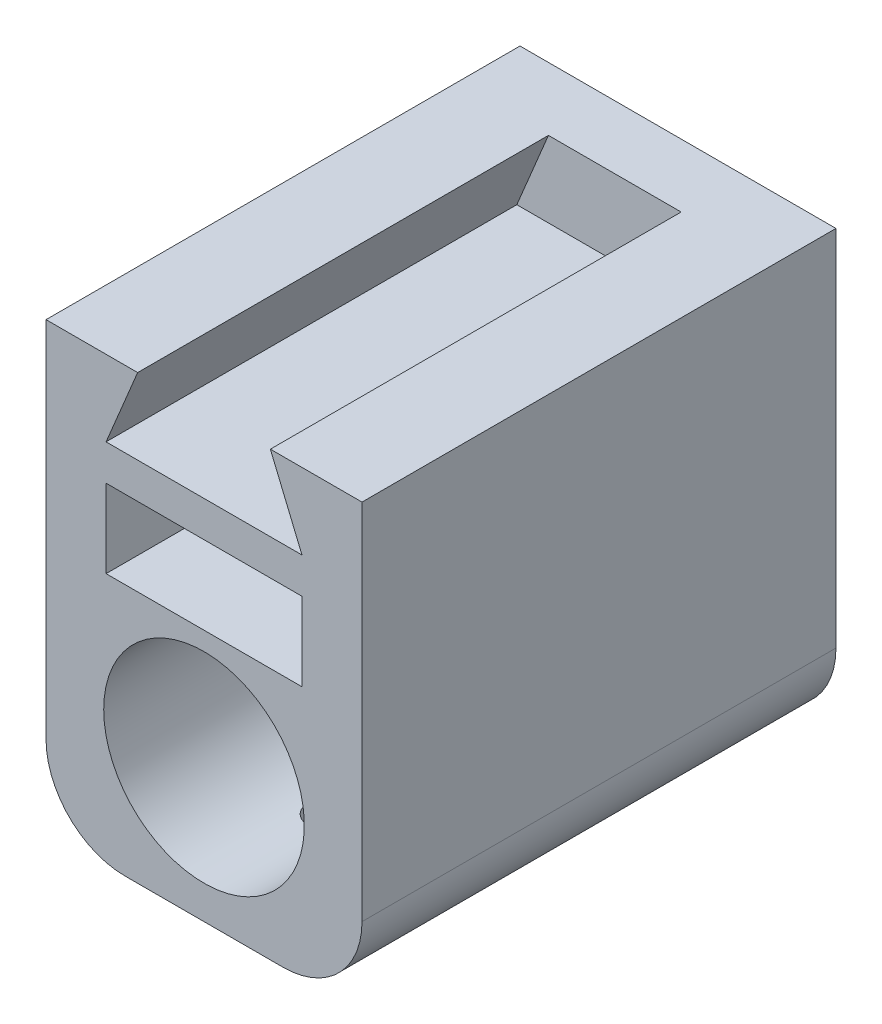
ISO-10303-21;
HEADER;
FILE_DESCRIPTION(('STEP AP214'),'2;1');
FILE_NAME('part.step','',(''),(''),'','','');
FILE_SCHEMA(('AUTOMOTIVE_DESIGN { 1 0 10303 214 1 1 1 1 }'));
ENDSEC;
DATA;
#1=APPLICATION_CONTEXT('core data for automotive mechanical design processes');
#2=APPLICATION_PROTOCOL_DEFINITION('international standard','automotive_design',2000,#1);
#3=PRODUCT_CONTEXT('',#1,'mechanical');
#4=PRODUCT('Part','Part','',(#3));
#5=PRODUCT_RELATED_PRODUCT_CATEGORY('part','',(#4));
#6=PRODUCT_DEFINITION_FORMATION('','',#4);
#7=PRODUCT_DEFINITION_CONTEXT('part definition',#1,'design');
#8=PRODUCT_DEFINITION('design','',#6,#7);
#9=PRODUCT_DEFINITION_SHAPE('','',#8);
#10=(LENGTH_UNIT() NAMED_UNIT(*) SI_UNIT(.MILLI.,.METRE.));
#11=(NAMED_UNIT(*) PLANE_ANGLE_UNIT() SI_UNIT($,.RADIAN.));
#12=(NAMED_UNIT(*) SI_UNIT($,.STERADIAN.) SOLID_ANGLE_UNIT());
#13=UNCERTAINTY_MEASURE_WITH_UNIT(LENGTH_MEASURE(1.E-05),#10,'distance_accuracy_value','');
#14=(GEOMETRIC_REPRESENTATION_CONTEXT(3) GLOBAL_UNCERTAINTY_ASSIGNED_CONTEXT((#13)) GLOBAL_UNIT_ASSIGNED_CONTEXT((#10,
#11,#12)) REPRESENTATION_CONTEXT('',''));
#15=CARTESIAN_POINT('',(0.,0.,0.));
#16=DIRECTION('',(0.,0.,1.));
#17=DIRECTION('',(1.,0.,0.));
#18=AXIS2_PLACEMENT_3D('',#15,#16,#17);
#19=CARTESIAN_POINT('',(-4.2,8.41779703520745,30.));
#20=DIRECTION('',(-0.923076923076923,0.384615384615385,0.));
#21=DIRECTION('',(-0.384615384615385,-0.923076923076923,0.));
#22=AXIS2_PLACEMENT_3D('',#19,#20,#21);
#23=PLANE('',#22);
#24=DIRECTION('',(-0.384615384615385,-0.923076923076923,0.));
#25=VECTOR('',#24,1.);
#26=CARTESIAN_POINT('',(-6.2,3.61779703520745,4.));
#27=LINE('',#26,#25);
#28=CARTESIAN_POINT('',(-4.2,8.41779703520745,4.));
#29=VERTEX_POINT('',#28);
#30=CARTESIAN_POINT('',(-6.2,3.61779703520745,4.));
#31=VERTEX_POINT('',#30);
#32=EDGE_CURVE('E513',#29,#31,#27,.T.);
#33=ORIENTED_EDGE('',*,*,#32,.F.);
#34=DIRECTION('',(0.,0.,-1.));
#35=VECTOR('',#34,1.);
#36=CARTESIAN_POINT('',(-4.2,8.41779703520745,30.));
#37=LINE('',#36,#35);
#38=CARTESIAN_POINT('',(-4.2,8.41779703520745,30.));
#39=VERTEX_POINT('',#38);
#40=EDGE_CURVE('E276',#39,#29,#37,.T.);
#41=ORIENTED_EDGE('',*,*,#40,.F.);
#42=DIRECTION('',(0.384615384615385,0.923076923076923,0.));
#43=VECTOR('',#42,1.);
#44=CARTESIAN_POINT('',(-4.2,8.41779703520745,30.));
#45=LINE('',#44,#43);
#46=CARTESIAN_POINT('',(-6.2,3.61779703520745,30.));
#47=VERTEX_POINT('',#46);
#48=EDGE_CURVE('E221',#47,#39,#45,.T.);
#49=ORIENTED_EDGE('',*,*,#48,.F.);
#50=DIRECTION('',(0.,0.,-1.));
#51=VECTOR('',#50,1.);
#52=CARTESIAN_POINT('',(-6.2,3.61779703520745,30.));
#53=LINE('',#52,#51);
#54=EDGE_CURVE('E247',#47,#31,#53,.T.);
#55=ORIENTED_EDGE('',*,*,#54,.T.);
#56=EDGE_LOOP('',(#33,#41,#49,#55));
#57=FACE_BOUND('',#56,.T.);
#58=ADVANCED_FACE('F45',(#57),#23,.F.);
#59=CARTESIAN_POINT('',(6.2,3.61779703520745,30.));
#60=DIRECTION('',(0.923076923076923,0.384615384615385,0.));
#61=DIRECTION('',(-0.384615384615385,0.923076923076923,0.));
#62=AXIS2_PLACEMENT_3D('',#59,#60,#61);
#63=PLANE('',#62);
#64=DIRECTION('',(-0.384615384615385,0.923076923076923,0.));
#65=VECTOR('',#64,1.);
#66=CARTESIAN_POINT('',(4.2,8.41779703520745,4.));
#67=LINE('',#66,#65);
#68=CARTESIAN_POINT('',(6.2,3.61779703520745,4.));
#69=VERTEX_POINT('',#68);
#70=CARTESIAN_POINT('',(4.2,8.41779703520745,4.));
#71=VERTEX_POINT('',#70);
#72=EDGE_CURVE('E196',#69,#71,#67,.T.);
#73=ORIENTED_EDGE('',*,*,#72,.F.);
#74=DIRECTION('',(0.,0.,-1.));
#75=VECTOR('',#74,1.);
#76=CARTESIAN_POINT('',(6.2,3.61779703520745,30.));
#77=LINE('',#76,#75);
#78=CARTESIAN_POINT('',(6.2,3.61779703520745,30.));
#79=VERTEX_POINT('',#78);
#80=EDGE_CURVE('E261',#79,#69,#77,.T.);
#81=ORIENTED_EDGE('',*,*,#80,.F.);
#82=DIRECTION('',(0.384615384615385,-0.923076923076923,0.));
#83=VECTOR('',#82,1.);
#84=CARTESIAN_POINT('',(6.2,3.61779703520745,30.));
#85=LINE('',#84,#83);
#86=CARTESIAN_POINT('',(4.2,8.41779703520745,30.));
#87=VERTEX_POINT('',#86);
#88=EDGE_CURVE('E241',#87,#79,#85,.T.);
#89=ORIENTED_EDGE('',*,*,#88,.F.);
#90=DIRECTION('',(0.,0.,-1.));
#91=VECTOR('',#90,1.);
#92=CARTESIAN_POINT('',(4.2,8.41779703520745,30.));
#93=LINE('',#92,#91);
#94=EDGE_CURVE('E265',#87,#71,#93,.T.);
#95=ORIENTED_EDGE('',*,*,#94,.T.);
#96=EDGE_LOOP('',(#73,#81,#89,#95));
#97=FACE_BOUND('',#96,.T.);
#98=ADVANCED_FACE('F340',(#97),#63,.F.);
#99=CARTESIAN_POINT('',(-6.2,3.61779703520745,30.));
#100=DIRECTION('',(0.,-1.,0.));
#101=DIRECTION('',(0.,0.,-1.));
#102=AXIS2_PLACEMENT_3D('',#99,#100,#101);
#103=PLANE('',#102);
#104=DIRECTION('',(1.,0.,0.));
#105=VECTOR('',#104,1.);
#106=CARTESIAN_POINT('',(6.2,3.61779703520745,4.));
#107=LINE('',#106,#105);
#108=EDGE_CURVE('E381',#31,#69,#107,.T.);
#109=ORIENTED_EDGE('',*,*,#108,.F.);
#110=ORIENTED_EDGE('',*,*,#54,.F.);
#111=DIRECTION('',(-1.,0.,0.));
#112=VECTOR('',#111,1.);
#113=CARTESIAN_POINT('',(-6.2,3.61779703520745,30.));
#114=LINE('',#113,#112);
#115=EDGE_CURVE('E244',#79,#47,#114,.T.);
#116=ORIENTED_EDGE('',*,*,#115,.F.);
#117=ORIENTED_EDGE('',*,*,#80,.T.);
#118=EDGE_LOOP('',(#109,#110,#116,#117));
#119=FACE_BOUND('',#118,.T.);
#120=ADVANCED_FACE('F346',(#119),#103,.F.);
#121=CARTESIAN_POINT('',(0.,0.,30.));
#122=DIRECTION('',(0.,0.,1.));
#123=DIRECTION('',(1.,0.,0.));
#124=AXIS2_PLACEMENT_3D('',#121,#122,#123);
#125=PLANE('',#124);
#126=DIRECTION('',(1.,0.,0.));
#127=VECTOR('',#126,1.);
#128=CARTESIAN_POINT('',(-10.,-19.5822029647926,30.));
#129=LINE('',#128,#127);
#130=CARTESIAN_POINT('',(-5.,-19.5822029647926,30.));
#131=VERTEX_POINT('',#130);
#132=CARTESIAN_POINT('',(5.,-19.5822029647926,30.));
#133=VERTEX_POINT('',#132);
#134=EDGE_CURVE('E232',#131,#133,#129,.T.);
#135=ORIENTED_EDGE('',*,*,#134,.T.);
#136=CARTESIAN_POINT('',(5.,-14.5822029647926,30.));
#137=DIRECTION('',(0.,0.,1.));
#138=DIRECTION('',(1.,0.,0.));
#139=AXIS2_PLACEMENT_3D('',#136,#137,#138);
#140=CIRCLE('',#139,5.);
#141=CARTESIAN_POINT('',(10.,-14.5822029647926,30.));
#142=VERTEX_POINT('',#141);
#143=EDGE_CURVE('E60',#133,#142,#140,.T.);
#144=ORIENTED_EDGE('',*,*,#143,.T.);
#145=DIRECTION('',(0.,1.,0.));
#146=VECTOR('',#145,1.);
#147=CARTESIAN_POINT('',(10.,-19.5822029647926,30.));
#148=LINE('',#147,#146);
#149=CARTESIAN_POINT('',(10.,8.41779703520745,30.));
#150=VERTEX_POINT('',#149);
#151=EDGE_CURVE('E235',#142,#150,#148,.T.);
#152=ORIENTED_EDGE('',*,*,#151,.T.);
#153=DIRECTION('',(-1.,0.,0.));
#154=VECTOR('',#153,1.);
#155=CARTESIAN_POINT('',(4.2,8.41779703520745,30.));
#156=LINE('',#155,#154);
#157=EDGE_CURVE('E238',#150,#87,#156,.T.);
#158=ORIENTED_EDGE('',*,*,#157,.T.);
#159=ORIENTED_EDGE('',*,*,#88,.T.);
#160=ORIENTED_EDGE('',*,*,#115,.T.);
#161=ORIENTED_EDGE('',*,*,#48,.T.);
#162=DIRECTION('',(-1.,0.,0.));
#163=VECTOR('',#162,1.);
#164=CARTESIAN_POINT('',(-4.2,8.41779703520745,30.));
#165=LINE('',#164,#163);
#166=CARTESIAN_POINT('',(-10.,8.41779703520745,30.));
#167=VERTEX_POINT('',#166);
#168=EDGE_CURVE('E225',#39,#167,#165,.T.);
#169=ORIENTED_EDGE('',*,*,#168,.T.);
#170=DIRECTION('',(0.,-1.,0.));
#171=VECTOR('',#170,1.);
#172=CARTESIAN_POINT('',(-10.,8.41779703520745,30.));
#173=LINE('',#172,#171);
#174=CARTESIAN_POINT('',(-10.,-14.5822029647926,30.));
#175=VERTEX_POINT('',#174);
#176=EDGE_CURVE('E229',#167,#175,#173,.T.);
#177=ORIENTED_EDGE('',*,*,#176,.T.);
#178=CARTESIAN_POINT('',(-5.,-14.5822029647926,30.));
#179=DIRECTION('',(0.,0.,1.));
#180=DIRECTION('',(1.,0.,0.));
#181=AXIS2_PLACEMENT_3D('',#178,#179,#180);
#182=CIRCLE('',#181,5.);
#183=EDGE_CURVE('E296',#175,#131,#182,.T.);
#184=ORIENTED_EDGE('',*,*,#183,.T.);
#185=EDGE_LOOP('',(#135,#144,#152,#158,#159,#160,#161,#169,#177,#184));
#186=FACE_BOUND('',#185,.T.);
#187=CARTESIAN_POINT('',(0.,-11.126254614674,30.));
#188=DIRECTION('',(0.,0.,1.));
#189=DIRECTION('',(-1.,0.,0.));
#190=AXIS2_PLACEMENT_3D('',#187,#188,#189);
#191=CIRCLE('',#190,6.35);
#192=CARTESIAN_POINT('',(-6.35,-11.126254614674,30.));
#193=VERTEX_POINT('',#192);
#194=EDGE_CURVE('E213',#193,#193,#191,.T.);
#195=ORIENTED_EDGE('',*,*,#194,.F.);
#196=EDGE_LOOP('',(#195));
#197=FACE_BOUND('',#196,.T.);
#198=DIRECTION('',(0.,-1.,0.));
#199=VECTOR('',#198,1.);
#200=CARTESIAN_POINT('',(-6.2,-3.60572029870184,30.));
#201=LINE('',#200,#199);
#202=CARTESIAN_POINT('',(-6.2,1.35321106935378,30.));
#203=VERTEX_POINT('',#202);
#204=CARTESIAN_POINT('',(-6.2,-3.60572029870184,30.));
#205=VERTEX_POINT('',#204);
#206=EDGE_CURVE('E168',#203,#205,#201,.T.);
#207=ORIENTED_EDGE('',*,*,#206,.F.);
#208=DIRECTION('',(-1.,0.,0.));
#209=VECTOR('',#208,1.);
#210=CARTESIAN_POINT('',(-6.2,1.35321106935378,30.));
#211=LINE('',#210,#209);
#212=CARTESIAN_POINT('',(6.2,1.35321106935378,30.));
#213=VERTEX_POINT('',#212);
#214=EDGE_CURVE('E157',#213,#203,#211,.T.);
#215=ORIENTED_EDGE('',*,*,#214,.F.);
#216=DIRECTION('',(0.,1.,0.));
#217=VECTOR('',#216,1.);
#218=CARTESIAN_POINT('',(6.2,-3.60572029870184,30.));
#219=LINE('',#218,#217);
#220=CARTESIAN_POINT('',(6.2,-3.60572029870184,30.));
#221=VERTEX_POINT('',#220);
#222=EDGE_CURVE('E187',#221,#213,#219,.T.);
#223=ORIENTED_EDGE('',*,*,#222,.F.);
#224=DIRECTION('',(1.,0.,0.));
#225=VECTOR('',#224,1.);
#226=CARTESIAN_POINT('',(-6.2,-3.60572029870184,30.));
#227=LINE('',#226,#225);
#228=EDGE_CURVE('E183',#205,#221,#227,.T.);
#229=ORIENTED_EDGE('',*,*,#228,.F.);
#230=EDGE_LOOP('',(#207,#215,#223,#229));
#231=FACE_BOUND('',#230,.T.);
#232=ADVANCED_FACE('F181',(#186,#197,#231),#125,.T.);
#233=CARTESIAN_POINT('',(0.,0.,0.));
#234=DIRECTION('',(0.,0.,1.));
#235=DIRECTION('',(1.,0.,0.));
#236=AXIS2_PLACEMENT_3D('',#233,#234,#235);
#237=PLANE('',#236);
#238=DIRECTION('',(0.,1.,0.));
#239=VECTOR('',#238,1.);
#240=CARTESIAN_POINT('',(10.,8.41779703520745,0.));
#241=LINE('',#240,#239);
#242=CARTESIAN_POINT('',(10.,-14.5822029647926,0.));
#243=VERTEX_POINT('',#242);
#244=CARTESIAN_POINT('',(10.,8.41779703520745,0.));
#245=VERTEX_POINT('',#244);
#246=EDGE_CURVE('E253',#243,#245,#241,.T.);
#247=ORIENTED_EDGE('',*,*,#246,.F.);
#248=CARTESIAN_POINT('',(5.,-14.5822029647926,0.));
#249=DIRECTION('',(0.,0.,1.));
#250=DIRECTION('',(1.,0.,0.));
#251=AXIS2_PLACEMENT_3D('',#248,#249,#250);
#252=CIRCLE('',#251,5.);
#253=CARTESIAN_POINT('',(5.,-19.5822029647926,0.));
#254=VERTEX_POINT('',#253);
#255=EDGE_CURVE('E287',#243,#254,#252,.F.);
#256=ORIENTED_EDGE('',*,*,#255,.T.);
#257=DIRECTION('',(1.,0.,0.));
#258=VECTOR('',#257,1.);
#259=CARTESIAN_POINT('',(-10.,-19.5822029647926,0.));
#260=LINE('',#259,#258);
#261=CARTESIAN_POINT('',(-5.,-19.5822029647926,0.));
#262=VERTEX_POINT('',#261);
#263=EDGE_CURVE('E250',#262,#254,#260,.T.);
#264=ORIENTED_EDGE('',*,*,#263,.F.);
#265=CARTESIAN_POINT('',(-5.,-14.5822029647926,0.));
#266=DIRECTION('',(0.,0.,1.));
#267=DIRECTION('',(1.,0.,0.));
#268=AXIS2_PLACEMENT_3D('',#265,#266,#267);
#269=CIRCLE('',#268,5.);
#270=CARTESIAN_POINT('',(-10.,-14.5822029647926,0.));
#271=VERTEX_POINT('',#270);
#272=EDGE_CURVE('E284',#262,#271,#269,.F.);
#273=ORIENTED_EDGE('',*,*,#272,.T.);
#274=DIRECTION('',(0.,-1.,0.));
#275=VECTOR('',#274,1.);
#276=CARTESIAN_POINT('',(-10.,-11.126254614674,0.));
#277=LINE('',#276,#275);
#278=CARTESIAN_POINT('',(-10.,8.41779703520745,0.));
#279=VERTEX_POINT('',#278);
#280=EDGE_CURVE('E217',#279,#271,#277,.T.);
#281=ORIENTED_EDGE('',*,*,#280,.F.);
#282=DIRECTION('',(-1.,0.,0.));
#283=VECTOR('',#282,1.);
#284=CARTESIAN_POINT('',(4.2,8.41779703520745,0.));
#285=LINE('',#284,#283);
#286=EDGE_CURVE('E226',#245,#279,#285,.T.);
#287=ORIENTED_EDGE('',*,*,#286,.F.);
#288=EDGE_LOOP('',(#247,#256,#264,#273,#281,#287));
#289=FACE_BOUND('',#288,.T.);
#290=CARTESIAN_POINT('',(0.,-11.126254614674,0.));
#291=DIRECTION('',(0.,0.,1.));
#292=DIRECTION('',(1.,0.,0.));
#293=AXIS2_PLACEMENT_3D('',#290,#291,#292);
#294=CIRCLE('',#293,6.35);
#295=CARTESIAN_POINT('',(6.35,-11.126254614674,0.));
#296=VERTEX_POINT('',#295);
#297=EDGE_CURVE('E177',#296,#296,#294,.T.);
#298=ORIENTED_EDGE('',*,*,#297,.T.);
#299=EDGE_LOOP('',(#298));
#300=FACE_BOUND('',#299,.T.);
#301=DIRECTION('',(-1.,0.,0.));
#302=VECTOR('',#301,1.);
#303=CARTESIAN_POINT('',(-6.2,1.35321106935378,0.));
#304=LINE('',#303,#302);
#305=CARTESIAN_POINT('',(6.2,1.35321106935378,0.));
#306=VERTEX_POINT('',#305);
#307=CARTESIAN_POINT('',(-6.2,1.35321106935378,0.));
#308=VERTEX_POINT('',#307);
#309=EDGE_CURVE('E193',#306,#308,#304,.T.);
#310=ORIENTED_EDGE('',*,*,#309,.T.);
#311=DIRECTION('',(0.,-1.,0.));
#312=VECTOR('',#311,1.);
#313=CARTESIAN_POINT('',(-6.2,-3.60572029870184,0.));
#314=LINE('',#313,#312);
#315=CARTESIAN_POINT('',(-6.2,-3.60572029870184,0.));
#316=VERTEX_POINT('',#315);
#317=EDGE_CURVE('E175',#308,#316,#314,.T.);
#318=ORIENTED_EDGE('',*,*,#317,.T.);
#319=DIRECTION('',(1.,0.,0.));
#320=VECTOR('',#319,1.);
#321=CARTESIAN_POINT('',(-6.2,-3.60572029870184,0.));
#322=LINE('',#321,#320);
#323=CARTESIAN_POINT('',(6.2,-3.60572029870184,0.));
#324=VERTEX_POINT('',#323);
#325=EDGE_CURVE('E199',#316,#324,#322,.T.);
#326=ORIENTED_EDGE('',*,*,#325,.T.);
#327=DIRECTION('',(0.,1.,0.));
#328=VECTOR('',#327,1.);
#329=CARTESIAN_POINT('',(6.2,-3.60572029870184,0.));
#330=LINE('',#329,#328);
#331=EDGE_CURVE('E169',#324,#306,#330,.T.);
#332=ORIENTED_EDGE('',*,*,#331,.T.);
#333=EDGE_LOOP('',(#310,#318,#326,#332));
#334=FACE_BOUND('',#333,.T.);
#335=ADVANCED_FACE('F389',(#289,#300,#334),#237,.F.);
#336=CARTESIAN_POINT('',(-10.,-11.126254614674,30.));
#337=DIRECTION('',(1.,0.,0.));
#338=DIRECTION('',(0.,0.,-1.));
#339=AXIS2_PLACEMENT_3D('',#336,#337,#338);
#340=PLANE('',#339);
#341=ORIENTED_EDGE('',*,*,#280,.T.);
#342=DIRECTION('',(0.,0.,-1.));
#343=VECTOR('',#342,1.);
#344=CARTESIAN_POINT('',(-10.,-14.5822029647926,30.));
#345=LINE('',#344,#343);
#346=EDGE_CURVE('E11',#271,#175,#345,.F.);
#347=ORIENTED_EDGE('',*,*,#346,.T.);
#348=ORIENTED_EDGE('',*,*,#176,.F.);
#349=DIRECTION('',(0.,0.,-1.));
#350=VECTOR('',#349,1.);
#351=CARTESIAN_POINT('',(-10.,8.41779703520745,30.));
#352=LINE('',#351,#350);
#353=EDGE_CURVE('E272',#167,#279,#352,.T.);
#354=ORIENTED_EDGE('',*,*,#353,.T.);
#355=EDGE_LOOP('',(#341,#347,#348,#354));
#356=FACE_BOUND('',#355,.T.);
#357=ADVANCED_FACE('F350',(#356),#340,.F.);
#358=CARTESIAN_POINT('',(-10.,-19.5822029647926,30.));
#359=DIRECTION('',(0.,1.,0.));
#360=DIRECTION('',(0.,0.,1.));
#361=AXIS2_PLACEMENT_3D('',#358,#359,#360);
#362=PLANE('',#361);
#363=CARTESIAN_POINT('',(0.,-19.5822029647926,22.5));
#364=DIRECTION('',(0.,-1.,0.));
#365=DIRECTION('',(0.,0.,-1.));
#366=AXIS2_PLACEMENT_3D('',#363,#364,#365);
#367=CIRCLE('',#366,1.);
#368=CARTESIAN_POINT('',(0.,-19.5822029647926,21.5));
#369=VERTEX_POINT('',#368);
#370=EDGE_CURVE('E307',#369,#369,#367,.T.);
#371=ORIENTED_EDGE('',*,*,#370,.F.);
#372=EDGE_LOOP('',(#371));
#373=FACE_BOUND('',#372,.T.);
#374=CARTESIAN_POINT('',(0.,-19.5822029647926,7.5));
#375=DIRECTION('',(0.,-1.,0.));
#376=DIRECTION('',(0.,0.,-1.));
#377=AXIS2_PLACEMENT_3D('',#374,#375,#376);
#378=CIRCLE('',#377,1.);
#379=CARTESIAN_POINT('',(0.,-19.5822029647926,6.5));
#380=VERTEX_POINT('',#379);
#381=EDGE_CURVE('E503',#380,#380,#378,.T.);
#382=ORIENTED_EDGE('',*,*,#381,.F.);
#383=EDGE_LOOP('',(#382));
#384=FACE_BOUND('',#383,.T.);
#385=ORIENTED_EDGE('',*,*,#263,.T.);
#386=DIRECTION('',(0.,0.,-1.));
#387=VECTOR('',#386,1.);
#388=CARTESIAN_POINT('',(5.,-19.5822029647926,30.));
#389=LINE('',#388,#387);
#390=EDGE_CURVE('E74',#254,#133,#389,.F.);
#391=ORIENTED_EDGE('',*,*,#390,.T.);
#392=ORIENTED_EDGE('',*,*,#134,.F.);
#393=DIRECTION('',(0.,0.,-1.));
#394=VECTOR('',#393,1.);
#395=CARTESIAN_POINT('',(-5.,-19.5822029647926,30.));
#396=LINE('',#395,#394);
#397=EDGE_CURVE('E290',#131,#262,#396,.T.);
#398=ORIENTED_EDGE('',*,*,#397,.T.);
#399=EDGE_LOOP('',(#385,#391,#392,#398));
#400=FACE_BOUND('',#399,.T.);
#401=ADVANCED_FACE('F388',(#373,#384,#400),#362,.F.);
#402=CARTESIAN_POINT('',(10.,8.41779703520745,30.));
#403=DIRECTION('',(-1.,0.,0.));
#404=DIRECTION('',(0.,-1.,0.));
#405=AXIS2_PLACEMENT_3D('',#402,#403,#404);
#406=PLANE('',#405);
#407=ORIENTED_EDGE('',*,*,#151,.F.);
#408=DIRECTION('',(0.,0.,-1.));
#409=VECTOR('',#408,1.);
#410=CARTESIAN_POINT('',(10.,-14.5822029647926,30.));
#411=LINE('',#410,#409);
#412=EDGE_CURVE('E280',#142,#243,#411,.T.);
#413=ORIENTED_EDGE('',*,*,#412,.T.);
#414=ORIENTED_EDGE('',*,*,#246,.T.);
#415=DIRECTION('',(0.,0.,-1.));
#416=VECTOR('',#415,1.);
#417=CARTESIAN_POINT('',(10.,8.41779703520745,30.));
#418=LINE('',#417,#416);
#419=EDGE_CURVE('E268',#150,#245,#418,.T.);
#420=ORIENTED_EDGE('',*,*,#419,.F.);
#421=EDGE_LOOP('',(#407,#413,#414,#420));
#422=FACE_BOUND('',#421,.T.);
#423=ADVANCED_FACE('F366',(#422),#406,.F.);
#424=CARTESIAN_POINT('',(4.2,8.41779703520745,30.));
#425=DIRECTION('',(0.,-1.,0.));
#426=DIRECTION('',(1.,0.,0.));
#427=AXIS2_PLACEMENT_3D('',#424,#425,#426);
#428=PLANE('',#427);
#429=ORIENTED_EDGE('',*,*,#286,.T.);
#430=ORIENTED_EDGE('',*,*,#353,.F.);
#431=ORIENTED_EDGE('',*,*,#168,.F.);
#432=ORIENTED_EDGE('',*,*,#40,.T.);
#433=DIRECTION('',(-1.,0.,0.));
#434=VECTOR('',#433,1.);
#435=CARTESIAN_POINT('',(-4.2,8.41779703520745,4.));
#436=LINE('',#435,#434);
#437=EDGE_CURVE('E509',#71,#29,#436,.T.);
#438=ORIENTED_EDGE('',*,*,#437,.F.);
#439=ORIENTED_EDGE('',*,*,#94,.F.);
#440=ORIENTED_EDGE('',*,*,#157,.F.);
#441=ORIENTED_EDGE('',*,*,#419,.T.);
#442=EDGE_LOOP('',(#429,#430,#431,#432,#438,#439,#440,#441));
#443=FACE_BOUND('',#442,.T.);
#444=ADVANCED_FACE('F337',(#443),#428,.F.);
#445=CARTESIAN_POINT('',(0.,-11.126254614674,30.));
#446=DIRECTION('',(0.,0.,-1.));
#447=DIRECTION('',(-1.,0.,0.));
#448=AXIS2_PLACEMENT_3D('',#445,#446,#447);
#449=CYLINDRICAL_SURFACE('',#448,6.35);
#450=CARTESIAN_POINT('',(0.,-17.476254614674,21.5));
#451=CARTESIAN_POINT('',(-0.0558003320742148,-17.4762536908854,21.5000022744791));
#452=CARTESIAN_POINT('',(-0.111632204345971,-17.4755114125861,21.5046862876585));
#453=CARTESIAN_POINT('',(-0.221733040867682,-17.4726217726161,21.5232925101723));
#454=CARTESIAN_POINT('',(-0.27600046905216,-17.470473076017,21.5372234966231));
#455=CARTESIAN_POINT('',(-0.381363300101671,-17.4650118639213,21.5738951205754));
#456=CARTESIAN_POINT('',(-0.432461150563512,-17.4617002599428,21.5966288596701));
#457=CARTESIAN_POINT('',(-0.530109710028942,-17.4542783730695,21.6502432675856));
#458=CARTESIAN_POINT('',(-0.576661000669009,-17.4501681925373,21.6811228924366));
#459=CARTESIAN_POINT('',(-0.664301485283561,-17.441566181924,21.7504344762484));
#460=CARTESIAN_POINT('',(-0.705346033614595,-17.437071665728,21.7889225596683));
#461=CARTESIAN_POINT('',(-0.780422532199137,-17.4282283639037,21.8722377304086));
#462=CARTESIAN_POINT('',(-0.814454062369895,-17.4238795870183,21.9170651971898));
#463=CARTESIAN_POINT('',(-0.874714554330391,-17.4157941144934,22.0120895879895));
#464=CARTESIAN_POINT('',(-0.900899900075353,-17.4120608904201,22.0623144925598));
#465=CARTESIAN_POINT('',(-0.944445905783669,-17.4056661588008,22.1665183032244));
#466=CARTESIAN_POINT('',(-0.961807096589749,-17.4030045867885,22.2204969832773));
#467=CARTESIAN_POINT('',(-0.987072427331072,-17.3990810730485,22.3302048769125));
#468=CARTESIAN_POINT('',(-0.995053290270382,-17.3978077826757,22.385916008074));
#469=CARTESIAN_POINT('',(-1.00156918614343,-17.3967706019149,22.4979001431011));
#470=CARTESIAN_POINT('',(-1.00010481624194,-17.3970066161026,22.5541731112204));
#471=CARTESIAN_POINT('',(-0.987834423672059,-17.3989510069971,22.6651390759536));
#472=CARTESIAN_POINT('',(-0.977114171571099,-17.4006458647407,22.7198418280659));
#473=CARTESIAN_POINT('',(-0.946770735976996,-17.4052958381399,22.8266623919793));
#474=CARTESIAN_POINT('',(-0.927147277176521,-17.4082509927665,22.8787801237904));
#475=CARTESIAN_POINT('',(-0.879466242664416,-17.4151033782256,22.9792103474751));
#476=CARTESIAN_POINT('',(-0.851372648815282,-17.4190046180181,23.0275054543422));
#477=CARTESIAN_POINT('',(-0.787574434603871,-17.4273067560123,23.1187285784015));
#478=CARTESIAN_POINT('',(-0.751869264537582,-17.431707690291,23.1616562076019));
#479=CARTESIAN_POINT('',(-0.673392149324446,-17.4405729319837,23.2414226474905));
#480=CARTESIAN_POINT('',(-0.6305465273893,-17.4450374025829,23.2781889927632));
#481=CARTESIAN_POINT('',(-0.539255003541546,-17.4534816472325,23.344020728029));
#482=CARTESIAN_POINT('',(-0.490809072353763,-17.457461418749,23.3730860777631));
#483=CARTESIAN_POINT('',(-0.389626999025971,-17.4644926414162,23.4226957367411));
#484=CARTESIAN_POINT('',(-0.336887894532341,-17.4675434445646,23.4432341015959));
#485=CARTESIAN_POINT('',(-0.22865024848836,-17.4723676704995,23.4751419326766));
#486=CARTESIAN_POINT('',(-0.173151913090988,-17.474141188564,23.4865120828061));
#487=CARTESIAN_POINT('',(-0.0615962576314434,-17.476198314144,23.4996635502541));
#488=CARTESIAN_POINT('',(-0.00555095000512151,-17.4764973907391,23.5015444290229));
#489=CARTESIAN_POINT('',(0.106054399622533,-17.4756141574466,23.4959287389139));
#490=CARTESIAN_POINT('',(0.161614458165948,-17.4744318982577,23.4884324909674));
#491=CARTESIAN_POINT('',(0.270367992045286,-17.4707284026884,23.4643581399131));
#492=CARTESIAN_POINT('',(0.323572547262239,-17.4682143704866,23.447828885462));
#493=CARTESIAN_POINT('',(0.426455268587871,-17.4621282019962,23.4062094840152));
#494=CARTESIAN_POINT('',(0.47613325451107,-17.4585560116906,23.3811188999693));
#495=CARTESIAN_POINT('',(0.570988134930571,-17.4507117673559,23.3228579165361));
#496=CARTESIAN_POINT('',(0.616126046049681,-17.446434367899,23.2896247814204));
#497=CARTESIAN_POINT('',(0.700219628193461,-17.4376715169637,23.216108948676));
#498=CARTESIAN_POINT('',(0.739174900722006,-17.4331860520985,23.1758257969966));
#499=CARTESIAN_POINT('',(0.810162647236763,-17.4244631341654,23.0889087285473));
#500=CARTESIAN_POINT('',(0.842128146953117,-17.4202283419084,23.0422198035939));
#501=CARTESIAN_POINT('',(0.897762469378254,-17.4125344876773,22.9440766240687));
#502=CARTESIAN_POINT('',(0.921431533796842,-17.4090754031046,22.892622508382));
#503=CARTESIAN_POINT('',(0.959698884610136,-17.4033441895544,22.7866038142683));
#504=CARTESIAN_POINT('',(0.974331581661074,-17.401067563088,22.7320519103027));
#505=CARTESIAN_POINT('',(0.994219832561755,-17.397947368529,22.6212260675606));
#506=CARTESIAN_POINT('',(0.999476106451985,-17.3971036903967,22.5649522613511));
#507=CARTESIAN_POINT('',(1.00044388237755,-17.3969493054356,22.4529480902807));
#508=CARTESIAN_POINT('',(0.996260736883521,-17.3976216780419,22.3972186306957));
#509=CARTESIAN_POINT('',(0.978695073806124,-17.4003867263862,22.2872666377553));
#510=CARTESIAN_POINT('',(0.965312577226987,-17.4024793988812,22.2330441009596));
#511=CARTESIAN_POINT('',(0.929766717236151,-17.4078431143419,22.1276793785062));
#512=CARTESIAN_POINT('',(0.907611465363793,-17.4111130685065,22.0765343974356));
#513=CARTESIAN_POINT('',(0.855159617419663,-17.4184641066562,21.9786703285836));
#514=CARTESIAN_POINT('',(0.824862689279551,-17.4225452237238,21.9319514214302));
#515=CARTESIAN_POINT('',(0.756607676441894,-17.4311128240475,21.8437316962097));
#516=CARTESIAN_POINT('',(0.718571783101454,-17.4356031458375,21.8022914432446));
#517=CARTESIAN_POINT('',(0.636082925844861,-17.4444517919167,21.7263450328225));
#518=CARTESIAN_POINT('',(0.591628477633975,-17.4488100853915,21.6918404836784));
#519=CARTESIAN_POINT('',(0.497243533336229,-17.4569342165829,21.6305547145375));
#520=CARTESIAN_POINT('',(0.447281263922897,-17.4606962750606,21.6038219296972));
#521=CARTESIAN_POINT('',(0.343538466210139,-17.4671671575256,21.5591684991592));
#522=CARTESIAN_POINT('',(0.289761890765385,-17.4698770535649,21.5412388789306));
#523=CARTESIAN_POINT('',(0.196464857266097,-17.4733315235889,21.5186918750765));
#524=CARTESIAN_POINT('',(0.1575154580693,-17.4744219536116,21.5116933563009));
#525=CARTESIAN_POINT('',(0.0790493107025279,-17.4758838212095,21.5023466465749));
#526=CARTESIAN_POINT('',(0.0395325707165044,-17.4762552691457,21.4999983886117));
#527=CARTESIAN_POINT('',(0.,-17.476254614674,21.5));
#528=B_SPLINE_CURVE_WITH_KNOTS('',3,(#450,#451,#452,#453,#454,#455,#456,#457,#458,#459,#460,
#461,#462,#463,#464,#465,#466,#467,#468,#469,#470,#471,#472,#473,#474,#475,#476,#477,#478,#479,
#480,#481,#482,#483,#484,#485,#486,#487,#488,#489,#490,#491,#492,#493,#494,#495,#496,#497,#498,
#499,#500,#501,#502,#503,#504,#505,#506,#507,#508,#509,#510,#511,#512,#513,#514,#515,#516,#517,
#518,#519,#520,#521,#522,#523,#524,#525,#526,#527),.UNSPECIFIED.,.T.,.F.,(4,2,2,2,2,2,2,2,2,2,2,
2,2,2,2,2,2,2,2,2,2,2,2,2,2,2,2,2,2,2,2,2,2,2,2,2,2,2,4),(0.,0.167256519802248,
0.334672024951573,0.501956597138837,0.669219740683288,0.837766139203605,1.00632263079165,
1.17579943024648,1.34526603312406,1.51333668044326,1.68139670177906,1.84791589123181,
2.01444023018634,2.18168292615362,2.34893770439432,2.51803927894028,2.68714173749134,
2.85636188473737,3.02556940782575,3.1929978582903,3.36042057868459,3.52694674383517,
3.69348141130921,3.86134191542058,4.02921323443207,4.19862869158423,4.36803921254634,
4.53680057151289,4.7055489702876,4.87242331091247,5.03929727052627,5.20601729268169,
5.37274411575181,5.54123835113847,5.70977161351247,5.8793337344565,6.04872263171335,
6.16721969502442,6.28571505071665),.UNSPECIFIED.);
#529=CARTESIAN_POINT('',(0.,-17.476254614674,21.5));
#530=VERTEX_POINT('',#529);
#531=EDGE_CURVE('E49',#530,#530,#528,.T.);
#532=ORIENTED_EDGE('',*,*,#531,.F.);
#533=EDGE_LOOP('',(#532));
#534=FACE_BOUND('',#533,.T.);
#535=CARTESIAN_POINT('',(0.,-17.476254614674,6.5));
#536=CARTESIAN_POINT('',(-0.0558003320742148,-17.4762536908854,6.50000227447907));
#537=CARTESIAN_POINT('',(-0.111632204345971,-17.4755114125861,6.50468628765849));
#538=CARTESIAN_POINT('',(-0.221733040867681,-17.4726217726161,6.52329251017226));
#539=CARTESIAN_POINT('',(-0.27600046905216,-17.470473076017,6.53722349662309));
#540=CARTESIAN_POINT('',(-0.381363300101671,-17.4650118639213,6.57389512057536));
#541=CARTESIAN_POINT('',(-0.432461150563512,-17.4617002599428,6.59662885967007));
#542=CARTESIAN_POINT('',(-0.530109710028941,-17.4542783730695,6.65024326758563));
#543=CARTESIAN_POINT('',(-0.576661000669009,-17.4501681925373,6.68112289243664));
#544=CARTESIAN_POINT('',(-0.664301485283562,-17.441566181924,6.7504344762484));
#545=CARTESIAN_POINT('',(-0.705346033614596,-17.437071665728,6.78892255966826));
#546=CARTESIAN_POINT('',(-0.780422532199139,-17.4282283639037,6.87223773040863));
#547=CARTESIAN_POINT('',(-0.814454062369896,-17.4238795870183,6.91706519718982));
#548=CARTESIAN_POINT('',(-0.874714554330392,-17.4157941144934,7.0120895879895));
#549=CARTESIAN_POINT('',(-0.900899900075353,-17.4120608904201,7.06231449255976));
#550=CARTESIAN_POINT('',(-0.944445905783669,-17.4056661588008,7.16651830322438));
#551=CARTESIAN_POINT('',(-0.961807096589749,-17.4030045867885,7.2204969832773));
#552=CARTESIAN_POINT('',(-0.987072427331071,-17.3990810730485,7.33020487691247));
#553=CARTESIAN_POINT('',(-0.995053290270382,-17.3978077826757,7.38591600807403));
#554=CARTESIAN_POINT('',(-1.00156918614343,-17.3967706019149,7.49790014310108));
#555=CARTESIAN_POINT('',(-1.00010481624194,-17.3970066161026,7.55417311122042));
#556=CARTESIAN_POINT('',(-0.987834423672059,-17.3989510069971,7.66513907595357));
#557=CARTESIAN_POINT('',(-0.977114171571099,-17.4006458647407,7.7198418280659));
#558=CARTESIAN_POINT('',(-0.946770735976997,-17.4052958381399,7.8266623919793));
#559=CARTESIAN_POINT('',(-0.927147277176521,-17.4082509927665,7.87878012379039));
#560=CARTESIAN_POINT('',(-0.879466242664416,-17.4151033782256,7.9792103474751));
#561=CARTESIAN_POINT('',(-0.85137264881528,-17.4190046180181,8.02750545434219));
#562=CARTESIAN_POINT('',(-0.78757443460387,-17.4273067560123,8.11872857840151));
#563=CARTESIAN_POINT('',(-0.751869264537583,-17.431707690291,8.1616562076019));
#564=CARTESIAN_POINT('',(-0.673392149324447,-17.4405729319837,8.24142264749053));
#565=CARTESIAN_POINT('',(-0.630546527389301,-17.4450374025829,8.27818899276317));
#566=CARTESIAN_POINT('',(-0.539255003541546,-17.4534816472325,8.34402072802895));
#567=CARTESIAN_POINT('',(-0.490809072353763,-17.457461418749,8.37308607776313));
#568=CARTESIAN_POINT('',(-0.389626999025972,-17.4644926414162,8.42269573674107));
#569=CARTESIAN_POINT('',(-0.336887894532342,-17.4675434445646,8.4432341015959));
#570=CARTESIAN_POINT('',(-0.228650248488361,-17.4723676704995,8.47514193267656));
#571=CARTESIAN_POINT('',(-0.17315191309099,-17.474141188564,8.48651208280605));
#572=CARTESIAN_POINT('',(-0.0615962576314444,-17.476198314144,8.49966355025407));
#573=CARTESIAN_POINT('',(-0.00555095000512235,-17.4764973907391,8.50154442902294));
#574=CARTESIAN_POINT('',(0.106054399622532,-17.4756141574466,8.49592873891387));
#575=CARTESIAN_POINT('',(0.161614458165947,-17.4744318982577,8.48843249096744));
#576=CARTESIAN_POINT('',(0.270367992045285,-17.4707284026884,8.46435813991307));
#577=CARTESIAN_POINT('',(0.323572547262237,-17.4682143704866,8.44782888546197));
#578=CARTESIAN_POINT('',(0.426455268587869,-17.4621282019962,8.40620948401524));
#579=CARTESIAN_POINT('',(0.476133254511068,-17.4585560116906,8.38111889996934));
#580=CARTESIAN_POINT('',(0.57098813493057,-17.4507117673559,8.32285791653605));
#581=CARTESIAN_POINT('',(0.616126046049681,-17.446434367899,8.28962478142044));
#582=CARTESIAN_POINT('',(0.700219628193461,-17.4376715169637,8.21610894867603));
#583=CARTESIAN_POINT('',(0.739174900722006,-17.4331860520985,8.17582579699665));
#584=CARTESIAN_POINT('',(0.810162647236764,-17.4244631341654,8.08890872854725));
#585=CARTESIAN_POINT('',(0.84212814695312,-17.4202283419084,8.04221980359388));
#586=CARTESIAN_POINT('',(0.897762469378256,-17.4125344876773,7.9440766240687));
#587=CARTESIAN_POINT('',(0.921431533796842,-17.4090754031046,7.89262250838202));
#588=CARTESIAN_POINT('',(0.959698884610136,-17.4033441895544,7.78660381426831));
#589=CARTESIAN_POINT('',(0.974331581661074,-17.401067563088,7.73205191030268));
#590=CARTESIAN_POINT('',(0.994219832561755,-17.397947368529,7.62122606756056));
#591=CARTESIAN_POINT('',(0.999476106451985,-17.3971036903967,7.56495226135112));
#592=CARTESIAN_POINT('',(1.00044388237755,-17.3969493054356,7.45294809028073));
#593=CARTESIAN_POINT('',(0.99626073688352,-17.3976216780419,7.39721863069574));
#594=CARTESIAN_POINT('',(0.978695073806123,-17.4003867263862,7.28726663775535));
#595=CARTESIAN_POINT('',(0.965312577226987,-17.4024793988812,7.23304410095958));
#596=CARTESIAN_POINT('',(0.929766717236151,-17.4078431143419,7.12767937850616));
#597=CARTESIAN_POINT('',(0.907611465363792,-17.4111130685065,7.07653439743563));
#598=CARTESIAN_POINT('',(0.855159617419661,-17.4184641066562,6.97867032858365));
#599=CARTESIAN_POINT('',(0.82486268927955,-17.4225452237238,6.93195142143024));
#600=CARTESIAN_POINT('',(0.756607676441893,-17.4311128240475,6.84373169620967));
#601=CARTESIAN_POINT('',(0.718571783101453,-17.4356031458375,6.80229144324464));
#602=CARTESIAN_POINT('',(0.63608292584486,-17.4444517919167,6.72634503282253));
#603=CARTESIAN_POINT('',(0.591628477633975,-17.4488100853915,6.69184048367838));
#604=CARTESIAN_POINT('',(0.497243533336229,-17.4569342165829,6.6305547145375));
#605=CARTESIAN_POINT('',(0.447281263922897,-17.4606962750606,6.60382192969722));
#606=CARTESIAN_POINT('',(0.343538466210139,-17.4671671575256,6.55916849915918));
#607=CARTESIAN_POINT('',(0.289761890765385,-17.4698770535649,6.54123887893059));
#608=CARTESIAN_POINT('',(0.196464857266097,-17.4733315235889,6.51869187507648));
#609=CARTESIAN_POINT('',(0.157515458069301,-17.4744219536116,6.51169335630091));
#610=CARTESIAN_POINT('',(0.0790493107025285,-17.4758838212095,6.50234664657488));
#611=CARTESIAN_POINT('',(0.0395325707165047,-17.4762552691457,6.49999838861166));
#612=CARTESIAN_POINT('',(0.,-17.476254614674,6.5));
#613=B_SPLINE_CURVE_WITH_KNOTS('',3,(#535,#536,#537,#538,#539,#540,#541,#542,#543,#544,#545,
#546,#547,#548,#549,#550,#551,#552,#553,#554,#555,#556,#557,#558,#559,#560,#561,#562,#563,#564,
#565,#566,#567,#568,#569,#570,#571,#572,#573,#574,#575,#576,#577,#578,#579,#580,#581,#582,#583,
#584,#585,#586,#587,#588,#589,#590,#591,#592,#593,#594,#595,#596,#597,#598,#599,#600,#601,#602,
#603,#604,#605,#606,#607,#608,#609,#610,#611,#612),.UNSPECIFIED.,.T.,.F.,(4,2,2,2,2,2,2,2,2,2,2,
2,2,2,2,2,2,2,2,2,2,2,2,2,2,2,2,2,2,2,2,2,2,2,2,2,2,2,4),(0.,0.167256519802248,
0.334672024951573,0.501956597138836,0.669219740683288,0.837766139203607,1.00632263079165,
1.17579943024648,1.34526603312407,1.51333668044326,1.68139670177906,1.84791589123181,
2.01444023018634,2.18168292615362,2.34893770439432,2.51803927894028,2.68714173749134,
2.85636188473737,3.02556940782575,3.1929978582903,3.36042057868459,3.52694674383517,
3.69348141130921,3.86134191542058,4.02921323443207,4.19862869158423,4.36803921254634,
4.53680057151289,4.7055489702876,4.87242331091248,5.03929727052627,5.20601729268169,
5.37274411575181,5.54123835113847,5.70977161351247,5.8793337344565,6.04872263171335,
6.16721969502442,6.28571505071665),.UNSPECIFIED.);
#614=CARTESIAN_POINT('',(0.,-17.476254614674,6.5));
#615=VERTEX_POINT('',#614);
#616=EDGE_CURVE('E300',#615,#615,#613,.T.);
#617=ORIENTED_EDGE('',*,*,#616,.F.);
#618=EDGE_LOOP('',(#617));
#619=FACE_BOUND('',#618,.T.);
#620=ORIENTED_EDGE('',*,*,#297,.F.);
#621=EDGE_LOOP('',(#620));
#622=FACE_BOUND('',#621,.T.);
#623=ORIENTED_EDGE('',*,*,#194,.T.);
#624=EDGE_LOOP('',(#623));
#625=FACE_BOUND('',#624,.T.);
#626=ADVANCED_FACE('F308',(#534,#619,#622,#625),#449,.F.);
#627=CARTESIAN_POINT('',(-6.2,1.35321106935378,30.));
#628=DIRECTION('',(0.,-1.,0.));
#629=DIRECTION('',(1.,0.,0.));
#630=AXIS2_PLACEMENT_3D('',#627,#628,#629);
#631=PLANE('',#630);
#632=ORIENTED_EDGE('',*,*,#309,.F.);
#633=DIRECTION('',(0.,0.,-1.));
#634=VECTOR('',#633,1.);
#635=CARTESIAN_POINT('',(6.2,1.35321106935378,30.));
#636=LINE('',#635,#634);
#637=EDGE_CURVE('E163',#213,#306,#636,.T.);
#638=ORIENTED_EDGE('',*,*,#637,.F.);
#639=ORIENTED_EDGE('',*,*,#214,.T.);
#640=DIRECTION('',(0.,0.,-1.));
#641=VECTOR('',#640,1.);
#642=CARTESIAN_POINT('',(-6.2,1.35321106935378,30.));
#643=LINE('',#642,#641);
#644=EDGE_CURVE('E160',#203,#308,#643,.T.);
#645=ORIENTED_EDGE('',*,*,#644,.T.);
#646=EDGE_LOOP('',(#632,#638,#639,#645));
#647=FACE_BOUND('',#646,.T.);
#648=ADVANCED_FACE('F159',(#647),#631,.T.);
#649=CARTESIAN_POINT('',(-6.2,-3.60572029870184,30.));
#650=DIRECTION('',(1.,0.,0.));
#651=DIRECTION('',(0.,0.,-1.));
#652=AXIS2_PLACEMENT_3D('',#649,#650,#651);
#653=PLANE('',#652);
#654=ORIENTED_EDGE('',*,*,#317,.F.);
#655=ORIENTED_EDGE('',*,*,#644,.F.);
#656=ORIENTED_EDGE('',*,*,#206,.T.);
#657=DIRECTION('',(0.,0.,-1.));
#658=VECTOR('',#657,1.);
#659=CARTESIAN_POINT('',(-6.2,-3.60572029870184,30.));
#660=LINE('',#659,#658);
#661=EDGE_CURVE('E178',#205,#316,#660,.T.);
#662=ORIENTED_EDGE('',*,*,#661,.T.);
#663=EDGE_LOOP('',(#654,#655,#656,#662));
#664=FACE_BOUND('',#663,.T.);
#665=ADVANCED_FACE('F172',(#664),#653,.T.);
#666=CARTESIAN_POINT('',(-6.2,-3.60572029870184,30.));
#667=DIRECTION('',(0.,1.,0.));
#668=DIRECTION('',(-1.,0.,0.));
#669=AXIS2_PLACEMENT_3D('',#666,#667,#668);
#670=PLANE('',#669);
#671=ORIENTED_EDGE('',*,*,#325,.F.);
#672=ORIENTED_EDGE('',*,*,#661,.F.);
#673=ORIENTED_EDGE('',*,*,#228,.T.);
#674=DIRECTION('',(0.,0.,-1.));
#675=VECTOR('',#674,1.);
#676=CARTESIAN_POINT('',(6.2,-3.60572029870184,30.));
#677=LINE('',#676,#675);
#678=EDGE_CURVE('E208',#221,#324,#677,.T.);
#679=ORIENTED_EDGE('',*,*,#678,.T.);
#680=EDGE_LOOP('',(#671,#672,#673,#679));
#681=FACE_BOUND('',#680,.T.);
#682=ADVANCED_FACE('F327',(#681),#670,.T.);
#683=CARTESIAN_POINT('',(6.2,-3.60572029870184,30.));
#684=DIRECTION('',(-1.,0.,0.));
#685=DIRECTION('',(0.,0.,1.));
#686=AXIS2_PLACEMENT_3D('',#683,#684,#685);
#687=PLANE('',#686);
#688=ORIENTED_EDGE('',*,*,#331,.F.);
#689=ORIENTED_EDGE('',*,*,#678,.F.);
#690=ORIENTED_EDGE('',*,*,#222,.T.);
#691=ORIENTED_EDGE('',*,*,#637,.T.);
#692=EDGE_LOOP('',(#688,#689,#690,#691));
#693=FACE_BOUND('',#692,.T.);
#694=ADVANCED_FACE('F323',(#693),#687,.T.);
#695=CARTESIAN_POINT('',(0.,0.,4.));
#696=DIRECTION('',(0.,0.,-1.));
#697=DIRECTION('',(-1.,0.,0.));
#698=AXIS2_PLACEMENT_3D('',#695,#696,#697);
#699=PLANE('',#698);
#700=ORIENTED_EDGE('',*,*,#437,.T.);
#701=ORIENTED_EDGE('',*,*,#32,.T.);
#702=ORIENTED_EDGE('',*,*,#108,.T.);
#703=ORIENTED_EDGE('',*,*,#72,.T.);
#704=EDGE_LOOP('',(#700,#701,#702,#703));
#705=FACE_BOUND('',#704,.T.);
#706=ADVANCED_FACE('F319',(#705),#699,.F.);
#707=CARTESIAN_POINT('',(5.,-14.5822029647926,30.));
#708=DIRECTION('',(0.,0.,-1.));
#709=DIRECTION('',(-1.,0.,0.));
#710=AXIS2_PLACEMENT_3D('',#707,#708,#709);
#711=CYLINDRICAL_SURFACE('',#710,5.);
#712=ORIENTED_EDGE('',*,*,#143,.F.);
#713=ORIENTED_EDGE('',*,*,#390,.F.);
#714=ORIENTED_EDGE('',*,*,#255,.F.);
#715=ORIENTED_EDGE('',*,*,#412,.F.);
#716=EDGE_LOOP('',(#712,#713,#714,#715));
#717=FACE_BOUND('',#716,.T.);
#718=ADVANCED_FACE('F322',(#717),#711,.T.);
#719=CARTESIAN_POINT('',(-5.,-14.5822029647926,30.));
#720=DIRECTION('',(0.,0.,-1.));
#721=DIRECTION('',(-1.,0.,0.));
#722=AXIS2_PLACEMENT_3D('',#719,#720,#721);
#723=CYLINDRICAL_SURFACE('',#722,5.);
#724=ORIENTED_EDGE('',*,*,#183,.F.);
#725=ORIENTED_EDGE('',*,*,#346,.F.);
#726=ORIENTED_EDGE('',*,*,#272,.F.);
#727=ORIENTED_EDGE('',*,*,#397,.F.);
#728=EDGE_LOOP('',(#724,#725,#726,#727));
#729=FACE_BOUND('',#728,.T.);
#730=ADVANCED_FACE('F47',(#729),#723,.T.);
#731=CARTESIAN_POINT('',(0.,-15.5822029647926,7.5));
#732=DIRECTION('',(0.,-1.,0.));
#733=DIRECTION('',(0.,0.,-1.));
#734=AXIS2_PLACEMENT_3D('',#731,#732,#733);
#735=CYLINDRICAL_SURFACE('',#734,1.);
#736=ORIENTED_EDGE('',*,*,#616,.T.);
#737=EDGE_LOOP('',(#736));
#738=FACE_BOUND('',#737,.T.);
#739=ORIENTED_EDGE('',*,*,#381,.T.);
#740=EDGE_LOOP('',(#739));
#741=FACE_BOUND('',#740,.T.);
#742=ADVANCED_FACE('F312',(#738,#741),#735,.F.);
#743=CARTESIAN_POINT('',(0.,-15.5822029647926,22.5));
#744=DIRECTION('',(0.,-1.,0.));
#745=DIRECTION('',(0.,0.,-1.));
#746=AXIS2_PLACEMENT_3D('',#743,#744,#745);
#747=CYLINDRICAL_SURFACE('',#746,1.);
#748=ORIENTED_EDGE('',*,*,#531,.T.);
#749=EDGE_LOOP('',(#748));
#750=FACE_BOUND('',#749,.T.);
#751=ORIENTED_EDGE('',*,*,#370,.T.);
#752=EDGE_LOOP('',(#751));
#753=FACE_BOUND('',#752,.T.);
#754=ADVANCED_FACE('F316',(#750,#753),#747,.F.);
#755=CLOSED_SHELL('',(#58,#98,#120,#232,#335,#357,#401,#423,#444,#626,#648,#665,#682,#694,#706,
#718,#730,#742,#754));
#756=MANIFOLD_SOLID_BREP('B2',#755);
#757=ADVANCED_BREP_SHAPE_REPRESENTATION('',(#18,#756),#14);
#758=SHAPE_DEFINITION_REPRESENTATION(#9,#757);
ENDSEC;
END-ISO-10303-21;
